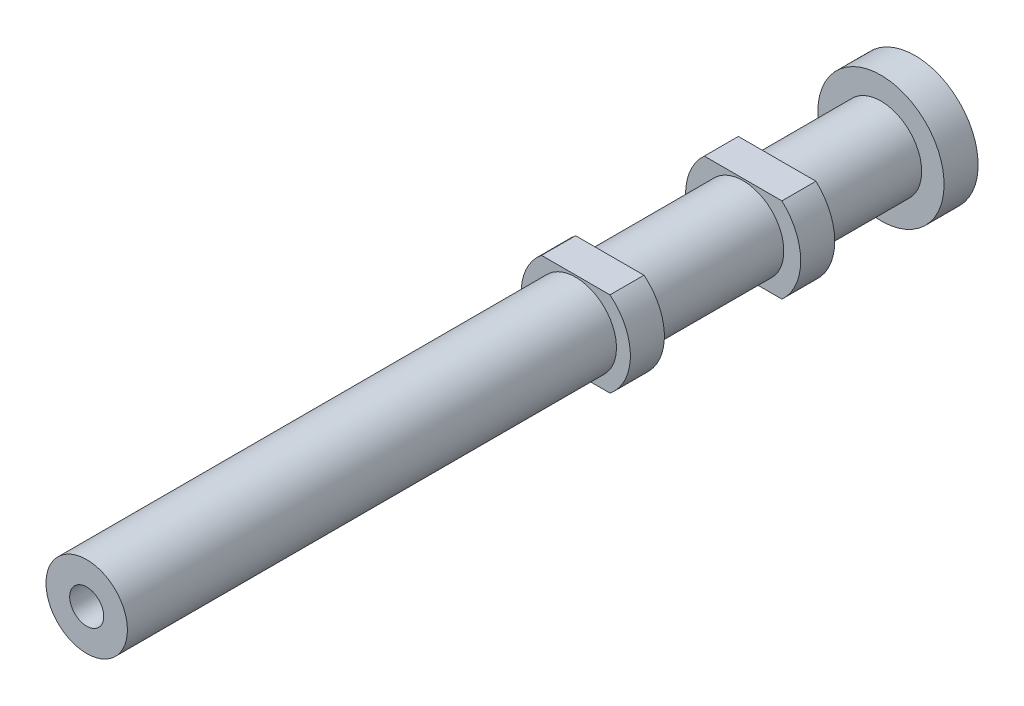
ISO-10303-21;
HEADER;
FILE_DESCRIPTION(('STEP AP214'),'2;1');
FILE_NAME('part.step','',(''),(''),'','','');
FILE_SCHEMA(('AUTOMOTIVE_DESIGN { 1 0 10303 214 1 1 1 1 }'));
ENDSEC;
DATA;
#1=APPLICATION_CONTEXT('core data for automotive mechanical design processes');
#2=APPLICATION_PROTOCOL_DEFINITION('international standard','automotive_design',2000,#1);
#3=PRODUCT_CONTEXT('',#1,'mechanical');
#4=PRODUCT('Part','Part','',(#3));
#5=PRODUCT_RELATED_PRODUCT_CATEGORY('part','',(#4));
#6=PRODUCT_DEFINITION_FORMATION('','',#4);
#7=PRODUCT_DEFINITION_CONTEXT('part definition',#1,'design');
#8=PRODUCT_DEFINITION('design','',#6,#7);
#9=PRODUCT_DEFINITION_SHAPE('','',#8);
#10=(LENGTH_UNIT() NAMED_UNIT(*) SI_UNIT(.MILLI.,.METRE.));
#11=(NAMED_UNIT(*) PLANE_ANGLE_UNIT() SI_UNIT($,.RADIAN.));
#12=(NAMED_UNIT(*) SI_UNIT($,.STERADIAN.) SOLID_ANGLE_UNIT());
#13=UNCERTAINTY_MEASURE_WITH_UNIT(LENGTH_MEASURE(1.E-05),#10,'distance_accuracy_value','');
#14=(GEOMETRIC_REPRESENTATION_CONTEXT(3) GLOBAL_UNCERTAINTY_ASSIGNED_CONTEXT((#13)) GLOBAL_UNIT_ASSIGNED_CONTEXT((#10,
#11,#12)) REPRESENTATION_CONTEXT('',''));
#15=CARTESIAN_POINT('',(0.,0.,0.));
#16=DIRECTION('',(0.,0.,1.));
#17=DIRECTION('',(1.,0.,0.));
#18=AXIS2_PLACEMENT_3D('',#15,#16,#17);
#19=CARTESIAN_POINT('',(0.,0.,-14.6));
#20=DIRECTION('',(0.,0.,-1.));
#21=DIRECTION('',(-1.,0.,0.));
#22=AXIS2_PLACEMENT_3D('',#19,#20,#21);
#23=CYLINDRICAL_SURFACE('',#22,1.925);
#24=CARTESIAN_POINT('',(0.,0.,-2.64));
#25=DIRECTION('',(0.,0.,-1.));
#26=DIRECTION('',(-1.,0.,0.));
#27=AXIS2_PLACEMENT_3D('',#24,#25,#26);
#28=CIRCLE('',#27,1.925);
#29=CARTESIAN_POINT('',(-1.20649285120139,-1.50000000000006,-2.64));
#30=VERTEX_POINT('',#29);
#31=CARTESIAN_POINT('',(-1.20649285120139,1.50000000000006,-2.64));
#32=VERTEX_POINT('',#31);
#33=EDGE_CURVE('E136',#30,#32,#28,.T.);
#34=ORIENTED_EDGE('',*,*,#33,.T.);
#35=DIRECTION('',(0.,0.,-1.));
#36=VECTOR('',#35,1.);
#37=CARTESIAN_POINT('',(-1.20649285120128,1.49999999999983,-14.6));
#38=LINE('',#37,#36);
#39=CARTESIAN_POINT('',(-1.20649285120139,1.50000000000006,-3.84));
#40=VERTEX_POINT('',#39);
#41=EDGE_CURVE('E62',#32,#40,#38,.T.);
#42=ORIENTED_EDGE('',*,*,#41,.T.);
#43=CARTESIAN_POINT('',(0.,0.,-3.84));
#44=DIRECTION('',(0.,0.,-1.));
#45=DIRECTION('',(-1.,0.,0.));
#46=AXIS2_PLACEMENT_3D('',#43,#44,#45);
#47=CIRCLE('',#46,1.925);
#48=CARTESIAN_POINT('',(-1.20649285120139,-1.50000000000006,-3.84));
#49=VERTEX_POINT('',#48);
#50=EDGE_CURVE('E146',#49,#40,#47,.T.);
#51=ORIENTED_EDGE('',*,*,#50,.F.);
#52=DIRECTION('',(0.,0.,-1.));
#53=VECTOR('',#52,1.);
#54=CARTESIAN_POINT('',(-1.20649285120139,-1.50000000000006,-14.6));
#55=LINE('',#54,#53);
#56=EDGE_CURVE('E290',#49,#30,#55,.F.);
#57=ORIENTED_EDGE('',*,*,#56,.T.);
#58=EDGE_LOOP('',(#34,#42,#51,#57));
#59=FACE_BOUND('',#58,.T.);
#60=ADVANCED_FACE('F38',(#59),#23,.T.);
#61=CARTESIAN_POINT('',(0.,0.,-14.6));
#62=DIRECTION('',(0.,0.,-1.));
#63=DIRECTION('',(-1.,0.,0.));
#64=AXIS2_PLACEMENT_3D('',#61,#62,#63);
#65=CYLINDRICAL_SURFACE('',#64,2.03);
#66=CARTESIAN_POINT('',(0.,0.,-8.54));
#67=DIRECTION('',(0.,0.,-1.));
#68=DIRECTION('',(-1.,0.,0.));
#69=AXIS2_PLACEMENT_3D('',#66,#67,#68);
#70=CIRCLE('',#69,2.03);
#71=CARTESIAN_POINT('',(-1.36780846612378,-1.50000000000028,-8.54));
#72=VERTEX_POINT('',#71);
#73=CARTESIAN_POINT('',(-1.36780846612383,1.49999999999983,-8.54000000000001));
#74=VERTEX_POINT('',#73);
#75=EDGE_CURVE('E138',#72,#74,#70,.T.);
#76=ORIENTED_EDGE('',*,*,#75,.T.);
#77=DIRECTION('',(0.,0.,-1.));
#78=VECTOR('',#77,1.);
#79=CARTESIAN_POINT('',(-1.36780846612378,1.49999999999983,-14.6));
#80=LINE('',#79,#78);
#81=CARTESIAN_POINT('',(-1.36780846612383,1.49999999999983,-9.74000000000001));
#82=VERTEX_POINT('',#81);
#83=EDGE_CURVE('E129',#74,#82,#80,.T.);
#84=ORIENTED_EDGE('',*,*,#83,.T.);
#85=CARTESIAN_POINT('',(0.,0.,-9.74));
#86=DIRECTION('',(0.,0.,-1.));
#87=DIRECTION('',(-1.,0.,0.));
#88=AXIS2_PLACEMENT_3D('',#85,#86,#87);
#89=CIRCLE('',#88,2.03);
#90=CARTESIAN_POINT('',(-1.36780846612378,-1.50000000000028,-9.74));
#91=VERTEX_POINT('',#90);
#92=EDGE_CURVE('E122',#91,#82,#89,.T.);
#93=ORIENTED_EDGE('',*,*,#92,.F.);
#94=DIRECTION('',(0.,0.,-1.));
#95=VECTOR('',#94,1.);
#96=CARTESIAN_POINT('',(-1.36780846612378,-1.50000000000028,-14.6));
#97=LINE('',#96,#95);
#98=EDGE_CURVE('E103',#91,#72,#97,.F.);
#99=ORIENTED_EDGE('',*,*,#98,.T.);
#100=EDGE_LOOP('',(#76,#84,#93,#99));
#101=FACE_BOUND('',#100,.T.);
#102=ADVANCED_FACE('F128',(#101),#65,.T.);
#103=CARTESIAN_POINT('',(0.,0.,14.6));
#104=DIRECTION('',(0.,0.,-1.));
#105=DIRECTION('',(-1.,0.,0.));
#106=AXIS2_PLACEMENT_3D('',#103,#104,#105);
#107=CYLINDRICAL_SURFACE('',#106,1.435);
#108=CARTESIAN_POINT('',(0.,0.,-9.74));
#109=DIRECTION('',(0.,0.,1.));
#110=DIRECTION('',(1.,0.,0.));
#111=AXIS2_PLACEMENT_3D('',#108,#109,#110);
#112=CIRCLE('',#111,1.435);
#113=CARTESIAN_POINT('',(1.435,0.,-9.74));
#114=VERTEX_POINT('',#113);
#115=EDGE_CURVE('E175',#114,#114,#112,.T.);
#116=ORIENTED_EDGE('',*,*,#115,.F.);
#117=EDGE_LOOP('',(#116));
#118=FACE_BOUND('',#117,.T.);
#119=CARTESIAN_POINT('',(0.,0.,-13.4));
#120=DIRECTION('',(0.,0.,-1.));
#121=DIRECTION('',(-1.,0.,0.));
#122=AXIS2_PLACEMENT_3D('',#119,#120,#121);
#123=CIRCLE('',#122,1.435);
#124=CARTESIAN_POINT('',(-1.435,0.,-13.4));
#125=VERTEX_POINT('',#124);
#126=EDGE_CURVE('E179',#125,#125,#123,.T.);
#127=ORIENTED_EDGE('',*,*,#126,.F.);
#128=EDGE_LOOP('',(#127));
#129=FACE_BOUND('',#128,.T.);
#130=ADVANCED_FACE('F40',(#118,#129),#107,.T.);
#131=CARTESIAN_POINT('',(0.,0.,-3.84));
#132=DIRECTION('',(0.,0.,1.));
#133=DIRECTION('',(1.,0.,0.));
#134=AXIS2_PLACEMENT_3D('',#131,#132,#133);
#135=CIRCLE('',#134,1.435);
#136=CARTESIAN_POINT('',(1.435,0.,-3.84));
#137=VERTEX_POINT('',#136);
#138=EDGE_CURVE('E167',#137,#137,#135,.T.);
#139=ORIENTED_EDGE('',*,*,#138,.F.);
#140=EDGE_LOOP('',(#139));
#141=FACE_BOUND('',#140,.T.);
#142=CARTESIAN_POINT('',(0.,0.,-8.54));
#143=DIRECTION('',(0.,0.,-1.));
#144=DIRECTION('',(-1.,0.,0.));
#145=AXIS2_PLACEMENT_3D('',#142,#143,#144);
#146=CIRCLE('',#145,1.435);
#147=CARTESIAN_POINT('',(-1.435,0.,-8.54));
#148=VERTEX_POINT('',#147);
#149=EDGE_CURVE('E171',#148,#148,#146,.T.);
#150=ORIENTED_EDGE('',*,*,#149,.F.);
#151=EDGE_LOOP('',(#150));
#152=FACE_BOUND('',#151,.T.);
#153=ADVANCED_FACE('F238',(#141,#152),#107,.T.);
#154=CARTESIAN_POINT('',(0.,0.,14.6));
#155=DIRECTION('',(0.,0.,1.));
#156=DIRECTION('',(1.,0.,0.));
#157=AXIS2_PLACEMENT_3D('',#154,#155,#156);
#158=CIRCLE('',#157,1.435);
#159=CARTESIAN_POINT('',(1.435,0.,14.6));
#160=VERTEX_POINT('',#159);
#161=EDGE_CURVE('E155',#160,#160,#158,.T.);
#162=ORIENTED_EDGE('',*,*,#161,.F.);
#163=EDGE_LOOP('',(#162));
#164=FACE_BOUND('',#163,.T.);
#165=CARTESIAN_POINT('',(0.,0.,-2.64));
#166=DIRECTION('',(0.,0.,-1.));
#167=DIRECTION('',(-1.,0.,0.));
#168=AXIS2_PLACEMENT_3D('',#165,#166,#167);
#169=CIRCLE('',#168,1.435);
#170=CARTESIAN_POINT('',(-1.435,0.,-2.64));
#171=VERTEX_POINT('',#170);
#172=EDGE_CURVE('E163',#171,#171,#169,.T.);
#173=ORIENTED_EDGE('',*,*,#172,.F.);
#174=EDGE_LOOP('',(#173));
#175=FACE_BOUND('',#174,.T.);
#176=ADVANCED_FACE('F240',(#164,#175),#107,.T.);
#177=CARTESIAN_POINT('',(0.,0.,14.6));
#178=DIRECTION('',(0.,0.,1.));
#179=DIRECTION('',(1.,0.,0.));
#180=AXIS2_PLACEMENT_3D('',#177,#178,#179);
#181=PLANE('',#180);
#182=CARTESIAN_POINT('',(0.,0.,14.6));
#183=DIRECTION('',(0.,0.,1.));
#184=DIRECTION('',(1.,0.,0.));
#185=AXIS2_PLACEMENT_3D('',#182,#183,#184);
#186=CIRCLE('',#185,0.6);
#187=CARTESIAN_POINT('',(0.6,0.,14.6));
#188=VERTEX_POINT('',#187);
#189=EDGE_CURVE('E156',#188,#188,#186,.T.);
#190=ORIENTED_EDGE('',*,*,#189,.F.);
#191=EDGE_LOOP('',(#190));
#192=FACE_BOUND('',#191,.T.);
#193=ORIENTED_EDGE('',*,*,#161,.T.);
#194=EDGE_LOOP('',(#193));
#195=FACE_BOUND('',#194,.T.);
#196=ADVANCED_FACE('F249',(#192,#195),#181,.T.);
#197=CARTESIAN_POINT('',(0.,0.,9.6));
#198=DIRECTION('',(0.,0.,1.));
#199=DIRECTION('',(1.,0.,0.));
#200=AXIS2_PLACEMENT_3D('',#197,#198,#199);
#201=CYLINDRICAL_SURFACE('',#200,0.6);
#202=CARTESIAN_POINT('',(0.,0.,9.6));
#203=DIRECTION('',(0.,0.,1.));
#204=DIRECTION('',(1.,0.,0.));
#205=AXIS2_PLACEMENT_3D('',#202,#203,#204);
#206=CIRCLE('',#205,0.6);
#207=CARTESIAN_POINT('',(0.6,0.,9.6));
#208=VERTEX_POINT('',#207);
#209=EDGE_CURVE('E151',#208,#208,#206,.T.);
#210=ORIENTED_EDGE('',*,*,#209,.F.);
#211=EDGE_LOOP('',(#210));
#212=FACE_BOUND('',#211,.T.);
#213=ORIENTED_EDGE('',*,*,#189,.T.);
#214=EDGE_LOOP('',(#213));
#215=FACE_BOUND('',#214,.T.);
#216=ADVANCED_FACE('F269',(#212,#215),#201,.F.);
#217=CARTESIAN_POINT('',(0.,0.,9.6));
#218=DIRECTION('',(0.,0.,1.));
#219=DIRECTION('',(1.,0.,0.));
#220=AXIS2_PLACEMENT_3D('',#217,#218,#219);
#221=PLANE('',#220);
#222=ORIENTED_EDGE('',*,*,#209,.T.);
#223=EDGE_LOOP('',(#222));
#224=FACE_BOUND('',#223,.T.);
#225=ADVANCED_FACE('F261',(#224),#221,.T.);
#226=CARTESIAN_POINT('',(1.2064928512015,1.49999999999895,-3.84));
#227=VERTEX_POINT('',#226);
#228=CARTESIAN_POINT('',(1.20649285120145,-1.50000000000006,-3.84));
#229=VERTEX_POINT('',#228);
#230=EDGE_CURVE('E150',#227,#229,#47,.T.);
#231=ORIENTED_EDGE('',*,*,#230,.F.);
#232=DIRECTION('',(0.,0.,-1.));
#233=VECTOR('',#232,1.);
#234=CARTESIAN_POINT('',(1.2064928512015,1.49999999999895,-14.6));
#235=LINE('',#234,#233);
#236=CARTESIAN_POINT('',(1.2064928512015,1.49999999999895,-2.64));
#237=VERTEX_POINT('',#236);
#238=EDGE_CURVE('E207',#227,#237,#235,.F.);
#239=ORIENTED_EDGE('',*,*,#238,.T.);
#240=CARTESIAN_POINT('',(1.20649285120145,-1.50000000000006,-2.64));
#241=VERTEX_POINT('',#240);
#242=EDGE_CURVE('E145',#237,#241,#28,.T.);
#243=ORIENTED_EDGE('',*,*,#242,.T.);
#244=DIRECTION('',(0.,0.,-1.));
#245=VECTOR('',#244,1.);
#246=CARTESIAN_POINT('',(1.20649285120145,-1.50000000000006,-14.6));
#247=LINE('',#246,#245);
#248=EDGE_CURVE('E54',#241,#229,#247,.T.);
#249=ORIENTED_EDGE('',*,*,#248,.T.);
#250=EDGE_LOOP('',(#231,#239,#243,#249));
#251=FACE_BOUND('',#250,.T.);
#252=ADVANCED_FACE('F254',(#251),#23,.T.);
#253=CARTESIAN_POINT('',(1.43500000000002,0.,-3.84));
#254=DIRECTION('',(0.,0.,1.));
#255=DIRECTION('',(1.,0.,0.));
#256=AXIS2_PLACEMENT_3D('',#253,#254,#255);
#257=PLANE('',#256);
#258=ORIENTED_EDGE('',*,*,#138,.T.);
#259=EDGE_LOOP('',(#258));
#260=FACE_BOUND('',#259,.T.);
#261=ORIENTED_EDGE('',*,*,#50,.T.);
#262=DIRECTION('',(1.,0.,0.));
#263=VECTOR('',#262,1.);
#264=CARTESIAN_POINT('',(1.43500000000019,1.49999999999895,-3.84));
#265=LINE('',#264,#263);
#266=EDGE_CURVE('E213',#40,#227,#265,.T.);
#267=ORIENTED_EDGE('',*,*,#266,.T.);
#268=ORIENTED_EDGE('',*,*,#230,.T.);
#269=DIRECTION('',(-1.,0.,0.));
#270=VECTOR('',#269,1.);
#271=CARTESIAN_POINT('',(1.43500000000002,-1.50000000000006,-3.84));
#272=LINE('',#271,#270);
#273=EDGE_CURVE('E194',#229,#49,#272,.T.);
#274=ORIENTED_EDGE('',*,*,#273,.T.);
#275=EDGE_LOOP('',(#261,#267,#268,#274));
#276=FACE_BOUND('',#275,.T.);
#277=ADVANCED_FACE('F260',(#260,#276),#257,.F.);
#278=CARTESIAN_POINT('',(1.43500000000002,0.,-2.64));
#279=DIRECTION('',(0.,0.,-1.));
#280=DIRECTION('',(-1.,0.,0.));
#281=AXIS2_PLACEMENT_3D('',#278,#279,#280);
#282=PLANE('',#281);
#283=ORIENTED_EDGE('',*,*,#242,.F.);
#284=DIRECTION('',(-1.,0.,0.));
#285=VECTOR('',#284,1.);
#286=CARTESIAN_POINT('',(1.43500000000019,1.49999999999895,-2.64));
#287=LINE('',#286,#285);
#288=EDGE_CURVE('E199',#237,#32,#287,.T.);
#289=ORIENTED_EDGE('',*,*,#288,.T.);
#290=ORIENTED_EDGE('',*,*,#33,.F.);
#291=DIRECTION('',(1.,0.,0.));
#292=VECTOR('',#291,1.);
#293=CARTESIAN_POINT('',(1.43500000000002,-1.50000000000006,-2.64));
#294=LINE('',#293,#292);
#295=EDGE_CURVE('E287',#30,#241,#294,.T.);
#296=ORIENTED_EDGE('',*,*,#295,.T.);
#297=EDGE_LOOP('',(#283,#289,#290,#296));
#298=FACE_BOUND('',#297,.T.);
#299=ORIENTED_EDGE('',*,*,#172,.T.);
#300=EDGE_LOOP('',(#299));
#301=FACE_BOUND('',#300,.T.);
#302=ADVANCED_FACE('F267',(#298,#301),#282,.F.);
#303=CARTESIAN_POINT('',(1.36780846612394,1.49999999999895,-9.74));
#304=VERTEX_POINT('',#303);
#305=CARTESIAN_POINT('',(1.36780846612389,-1.50000000000072,-9.74));
#306=VERTEX_POINT('',#305);
#307=EDGE_CURVE('E124',#304,#306,#89,.T.);
#308=ORIENTED_EDGE('',*,*,#307,.F.);
#309=DIRECTION('',(0.,0.,-1.));
#310=VECTOR('',#309,1.);
#311=CARTESIAN_POINT('',(1.36780846612394,1.49999999999895,-14.6));
#312=LINE('',#311,#310);
#313=CARTESIAN_POINT('',(1.36780846612394,1.49999999999895,-8.54));
#314=VERTEX_POINT('',#313);
#315=EDGE_CURVE('E191',#304,#314,#312,.F.);
#316=ORIENTED_EDGE('',*,*,#315,.T.);
#317=CARTESIAN_POINT('',(1.36780846612389,-1.50000000000072,-8.54));
#318=VERTEX_POINT('',#317);
#319=EDGE_CURVE('E131',#314,#318,#70,.T.);
#320=ORIENTED_EDGE('',*,*,#319,.T.);
#321=DIRECTION('',(0.,0.,-1.));
#322=VECTOR('',#321,1.);
#323=CARTESIAN_POINT('',(1.36780846612389,-1.50000000000072,-14.6));
#324=LINE('',#323,#322);
#325=EDGE_CURVE('E114',#318,#306,#324,.T.);
#326=ORIENTED_EDGE('',*,*,#325,.T.);
#327=EDGE_LOOP('',(#308,#316,#320,#326));
#328=FACE_BOUND('',#327,.T.);
#329=ADVANCED_FACE('F190',(#328),#65,.T.);
#330=CARTESIAN_POINT('',(1.43500000000002,0.,-9.74));
#331=DIRECTION('',(0.,0.,1.));
#332=DIRECTION('',(1.,0.,0.));
#333=AXIS2_PLACEMENT_3D('',#330,#331,#332);
#334=PLANE('',#333);
#335=ORIENTED_EDGE('',*,*,#115,.T.);
#336=EDGE_LOOP('',(#335));
#337=FACE_BOUND('',#336,.T.);
#338=ORIENTED_EDGE('',*,*,#92,.T.);
#339=DIRECTION('',(-1.,0.,0.));
#340=VECTOR('',#339,1.);
#341=CARTESIAN_POINT('',(-1.99999999999995,1.49999999999939,-9.74));
#342=LINE('',#341,#340);
#343=EDGE_CURVE('E115',#304,#82,#342,.T.);
#344=ORIENTED_EDGE('',*,*,#343,.F.);
#345=ORIENTED_EDGE('',*,*,#307,.T.);
#346=DIRECTION('',(1.,0.,0.));
#347=VECTOR('',#346,1.);
#348=CARTESIAN_POINT('',(-1.99999999999995,-1.5000000000005,-9.74));
#349=LINE('',#348,#347);
#350=EDGE_CURVE('E106',#91,#306,#349,.T.);
#351=ORIENTED_EDGE('',*,*,#350,.F.);
#352=EDGE_LOOP('',(#338,#344,#345,#351));
#353=FACE_BOUND('',#352,.T.);
#354=ADVANCED_FACE('F120',(#337,#353),#334,.F.);
#355=CARTESIAN_POINT('',(1.43500000000002,0.,-8.54));
#356=DIRECTION('',(0.,0.,-1.));
#357=DIRECTION('',(-1.,0.,0.));
#358=AXIS2_PLACEMENT_3D('',#355,#356,#357);
#359=PLANE('',#358);
#360=ORIENTED_EDGE('',*,*,#319,.F.);
#361=DIRECTION('',(-1.,0.,0.));
#362=VECTOR('',#361,1.);
#363=CARTESIAN_POINT('',(1.43500000000019,1.49999999999895,-8.54000000000001));
#364=LINE('',#363,#362);
#365=EDGE_CURVE('E11',#314,#74,#364,.T.);
#366=ORIENTED_EDGE('',*,*,#365,.T.);
#367=ORIENTED_EDGE('',*,*,#75,.F.);
#368=DIRECTION('',(1.,0.,0.));
#369=VECTOR('',#368,1.);
#370=CARTESIAN_POINT('',(1.43500000000008,-1.50000000000006,-8.54));
#371=LINE('',#370,#369);
#372=EDGE_CURVE('E47',#72,#318,#371,.T.);
#373=ORIENTED_EDGE('',*,*,#372,.T.);
#374=EDGE_LOOP('',(#360,#366,#367,#373));
#375=FACE_BOUND('',#374,.T.);
#376=ORIENTED_EDGE('',*,*,#149,.T.);
#377=EDGE_LOOP('',(#376));
#378=FACE_BOUND('',#377,.T.);
#379=ADVANCED_FACE('F186',(#375,#378),#359,.F.);
#380=CARTESIAN_POINT('',(1.43500000000002,0.,-13.4));
#381=DIRECTION('',(0.,0.,-1.));
#382=DIRECTION('',(-1.,0.,0.));
#383=AXIS2_PLACEMENT_3D('',#380,#381,#382);
#384=PLANE('',#383);
#385=CARTESIAN_POINT('',(0.,0.,-13.4));
#386=DIRECTION('',(0.,0.,-1.));
#387=DIRECTION('',(-1.,0.,0.));
#388=AXIS2_PLACEMENT_3D('',#385,#386,#387);
#389=CIRCLE('',#388,2.225);
#390=CARTESIAN_POINT('',(-2.225,0.,-13.4));
#391=VERTEX_POINT('',#390);
#392=EDGE_CURVE('E220',#391,#391,#389,.T.);
#393=ORIENTED_EDGE('',*,*,#392,.F.);
#394=EDGE_LOOP('',(#393));
#395=FACE_BOUND('',#394,.T.);
#396=ORIENTED_EDGE('',*,*,#126,.T.);
#397=EDGE_LOOP('',(#396));
#398=FACE_BOUND('',#397,.T.);
#399=ADVANCED_FACE('F231',(#395,#398),#384,.F.);
#400=CARTESIAN_POINT('',(0.,0.,-14.6));
#401=DIRECTION('',(0.,0.,-1.));
#402=DIRECTION('',(-1.,0.,0.));
#403=AXIS2_PLACEMENT_3D('',#400,#401,#402);
#404=CYLINDRICAL_SURFACE('',#403,2.225);
#405=CARTESIAN_POINT('',(0.,0.,-14.6));
#406=DIRECTION('',(0.,0.,-1.));
#407=DIRECTION('',(-1.,0.,0.));
#408=AXIS2_PLACEMENT_3D('',#405,#406,#407);
#409=CIRCLE('',#408,2.225);
#410=CARTESIAN_POINT('',(-2.225,0.,-14.6));
#411=VERTEX_POINT('',#410);
#412=EDGE_CURVE('E217',#411,#411,#409,.T.);
#413=ORIENTED_EDGE('',*,*,#412,.F.);
#414=EDGE_LOOP('',(#413));
#415=FACE_BOUND('',#414,.T.);
#416=ORIENTED_EDGE('',*,*,#392,.T.);
#417=EDGE_LOOP('',(#416));
#418=FACE_BOUND('',#417,.T.);
#419=ADVANCED_FACE('F229',(#415,#418),#404,.T.);
#420=CARTESIAN_POINT('',(0.,0.,-14.6));
#421=DIRECTION('',(0.,0.,1.));
#422=DIRECTION('',(1.,0.,0.));
#423=AXIS2_PLACEMENT_3D('',#420,#421,#422);
#424=PLANE('',#423);
#425=ORIENTED_EDGE('',*,*,#412,.T.);
#426=EDGE_LOOP('',(#425));
#427=FACE_BOUND('',#426,.T.);
#428=ADVANCED_FACE('F314',(#427),#424,.F.);
#429=CARTESIAN_POINT('',(-1.99999999999995,-1.5000000000005,-13.8631056256177));
#430=DIRECTION('',(0.,1.,0.));
#431=DIRECTION('',(0.,0.,1.));
#432=AXIS2_PLACEMENT_3D('',#429,#430,#431);
#433=PLANE('',#432);
#434=ORIENTED_EDGE('',*,*,#372,.F.);
#435=ORIENTED_EDGE('',*,*,#98,.F.);
#436=ORIENTED_EDGE('',*,*,#350,.T.);
#437=ORIENTED_EDGE('',*,*,#325,.F.);
#438=EDGE_LOOP('',(#434,#435,#436,#437));
#439=FACE_BOUND('',#438,.T.);
#440=ADVANCED_FACE('F105',(#439),#433,.F.);
#441=CARTESIAN_POINT('',(-1.99999999999995,1.49999999999939,-13.8631056256177));
#442=DIRECTION('',(0.,-1.,0.));
#443=DIRECTION('',(1.,0.,0.));
#444=AXIS2_PLACEMENT_3D('',#441,#442,#443);
#445=PLANE('',#444);
#446=ORIENTED_EDGE('',*,*,#365,.F.);
#447=ORIENTED_EDGE('',*,*,#315,.F.);
#448=ORIENTED_EDGE('',*,*,#343,.T.);
#449=ORIENTED_EDGE('',*,*,#83,.F.);
#450=EDGE_LOOP('',(#446,#447,#448,#449));
#451=FACE_BOUND('',#450,.T.);
#452=ADVANCED_FACE('F304',(#451),#445,.F.);
#453=ORIENTED_EDGE('',*,*,#248,.F.);
#454=ORIENTED_EDGE('',*,*,#295,.F.);
#455=ORIENTED_EDGE('',*,*,#56,.F.);
#456=ORIENTED_EDGE('',*,*,#273,.F.);
#457=EDGE_LOOP('',(#453,#454,#455,#456));
#458=FACE_BOUND('',#457,.T.);
#459=ADVANCED_FACE('F306',(#458),#433,.F.);
#460=ORIENTED_EDGE('',*,*,#41,.F.);
#461=ORIENTED_EDGE('',*,*,#288,.F.);
#462=ORIENTED_EDGE('',*,*,#238,.F.);
#463=ORIENTED_EDGE('',*,*,#266,.F.);
#464=EDGE_LOOP('',(#460,#461,#462,#463));
#465=FACE_BOUND('',#464,.T.);
#466=ADVANCED_FACE('F308',(#465),#445,.F.);
#467=CLOSED_SHELL('',(#60,#102,#130,#153,#176,#196,#216,#225,#252,#277,#302,#329,#354,#379,#399,
#419,#428,#440,#452,#459,#466));
#468=MANIFOLD_SOLID_BREP('B2',#467);
#469=ADVANCED_BREP_SHAPE_REPRESENTATION('',(#18,#468),#14);
#470=SHAPE_DEFINITION_REPRESENTATION(#9,#469);
ENDSEC;
END-ISO-10303-21;
